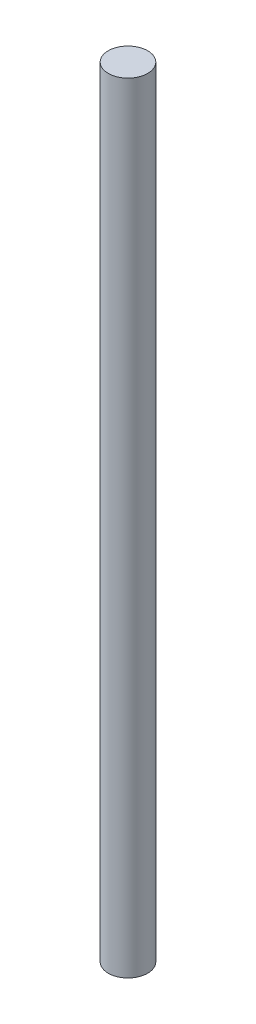
ISO-10303-21;
HEADER;
FILE_DESCRIPTION(('STEP AP214'),'2;1');
FILE_NAME('part.step','',(''),(''),'','','');
FILE_SCHEMA(('AUTOMOTIVE_DESIGN { 1 0 10303 214 1 1 1 1 }'));
ENDSEC;
DATA;
#1=APPLICATION_CONTEXT('core data for automotive mechanical design processes');
#2=APPLICATION_PROTOCOL_DEFINITION('international standard','automotive_design',2000,#1);
#3=PRODUCT_CONTEXT('',#1,'mechanical');
#4=PRODUCT('Part','Part','',(#3));
#5=PRODUCT_RELATED_PRODUCT_CATEGORY('part','',(#4));
#6=PRODUCT_DEFINITION_FORMATION('','',#4);
#7=PRODUCT_DEFINITION_CONTEXT('part definition',#1,'design');
#8=PRODUCT_DEFINITION('design','',#6,#7);
#9=PRODUCT_DEFINITION_SHAPE('','',#8);
#10=(LENGTH_UNIT() NAMED_UNIT(*) SI_UNIT(.MILLI.,.METRE.));
#11=(NAMED_UNIT(*) PLANE_ANGLE_UNIT() SI_UNIT($,.RADIAN.));
#12=(NAMED_UNIT(*) SI_UNIT($,.STERADIAN.) SOLID_ANGLE_UNIT());
#13=UNCERTAINTY_MEASURE_WITH_UNIT(LENGTH_MEASURE(1.E-05),#10,'distance_accuracy_value','');
#14=(GEOMETRIC_REPRESENTATION_CONTEXT(3) GLOBAL_UNCERTAINTY_ASSIGNED_CONTEXT((#13)) GLOBAL_UNIT_ASSIGNED_CONTEXT((#10,
#11,#12)) REPRESENTATION_CONTEXT('',''));
#15=CARTESIAN_POINT('',(0.,0.,0.));
#16=DIRECTION('',(0.,0.,1.));
#17=DIRECTION('',(1.,0.,0.));
#18=AXIS2_PLACEMENT_3D('',#15,#16,#17);
#19=CARTESIAN_POINT('',(0.,24.75,0.));
#20=DIRECTION('',(0.,-1.,0.));
#21=DIRECTION('',(0.,0.,-1.));
#22=AXIS2_PLACEMENT_3D('',#19,#20,#21);
#23=CYLINDRICAL_SURFACE('',#22,1.24999999999997);
#24=CARTESIAN_POINT('',(0.,24.75,0.));
#25=DIRECTION('',(0.,1.,0.));
#26=DIRECTION('',(0.,0.,1.));
#27=AXIS2_PLACEMENT_3D('',#24,#25,#26);
#28=CIRCLE('',#27,1.24999999999997);
#29=CARTESIAN_POINT('',(0.,24.75,1.24999999999997));
#30=VERTEX_POINT('',#29);
#31=EDGE_CURVE('E10',#30,#30,#28,.T.);
#32=ORIENTED_EDGE('',*,*,#31,.F.);
#33=EDGE_LOOP('',(#32));
#34=FACE_BOUND('',#33,.T.);
#35=CARTESIAN_POINT('',(0.,-24.75,0.));
#36=DIRECTION('',(0.,1.,0.));
#37=DIRECTION('',(0.,0.,1.));
#38=AXIS2_PLACEMENT_3D('',#35,#36,#37);
#39=CIRCLE('',#38,1.24999999999997);
#40=CARTESIAN_POINT('',(0.,-24.75,1.24999999999997));
#41=VERTEX_POINT('',#40);
#42=EDGE_CURVE('E33',#41,#41,#39,.T.);
#43=ORIENTED_EDGE('',*,*,#42,.T.);
#44=EDGE_LOOP('',(#43));
#45=FACE_BOUND('',#44,.T.);
#46=ADVANCED_FACE('F30',(#34,#45),#23,.T.);
#47=CARTESIAN_POINT('',(0.,24.75,0.));
#48=DIRECTION('',(0.,1.,0.));
#49=DIRECTION('',(0.,0.,1.));
#50=AXIS2_PLACEMENT_3D('',#47,#48,#49);
#51=PLANE('',#50);
#52=ORIENTED_EDGE('',*,*,#31,.T.);
#53=EDGE_LOOP('',(#52));
#54=FACE_BOUND('',#53,.T.);
#55=ADVANCED_FACE('F45',(#54),#51,.T.);
#56=CARTESIAN_POINT('',(0.,-24.75,0.));
#57=DIRECTION('',(0.,1.,0.));
#58=DIRECTION('',(0.,0.,1.));
#59=AXIS2_PLACEMENT_3D('',#56,#57,#58);
#60=PLANE('',#59);
#61=ORIENTED_EDGE('',*,*,#42,.F.);
#62=EDGE_LOOP('',(#61));
#63=FACE_BOUND('',#62,.T.);
#64=ADVANCED_FACE('F43',(#63),#60,.F.);
#65=CLOSED_SHELL('',(#46,#55,#64));
#66=MANIFOLD_SOLID_BREP('B2',#65);
#67=ADVANCED_BREP_SHAPE_REPRESENTATION('',(#18,#66),#14);
#68=SHAPE_DEFINITION_REPRESENTATION(#9,#67);
ENDSEC;
END-ISO-10303-21;
